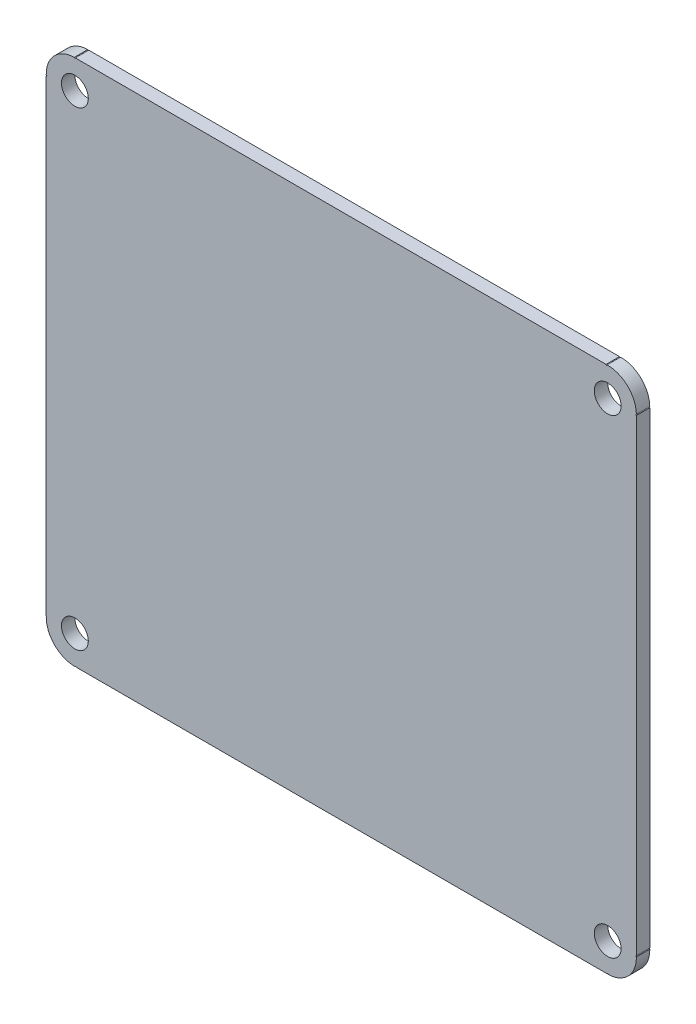
ISO-10303-21;
HEADER;
FILE_DESCRIPTION(('STEP AP214'),'2;1');
FILE_NAME('part.step','',(''),(''),'','','');
FILE_SCHEMA(('AUTOMOTIVE_DESIGN { 1 0 10303 214 1 1 1 1 }'));
ENDSEC;
DATA;
#1=APPLICATION_CONTEXT('core data for automotive mechanical design processes');
#2=APPLICATION_PROTOCOL_DEFINITION('international standard','automotive_design',2000,#1);
#3=PRODUCT_CONTEXT('',#1,'mechanical');
#4=PRODUCT('Part','Part','',(#3));
#5=PRODUCT_RELATED_PRODUCT_CATEGORY('part','',(#4));
#6=PRODUCT_DEFINITION_FORMATION('','',#4);
#7=PRODUCT_DEFINITION_CONTEXT('part definition',#1,'design');
#8=PRODUCT_DEFINITION('design','',#6,#7);
#9=PRODUCT_DEFINITION_SHAPE('','',#8);
#10=(LENGTH_UNIT() NAMED_UNIT(*) SI_UNIT(.MILLI.,.METRE.));
#11=(NAMED_UNIT(*) PLANE_ANGLE_UNIT() SI_UNIT($,.RADIAN.));
#12=(NAMED_UNIT(*) SI_UNIT($,.STERADIAN.) SOLID_ANGLE_UNIT());
#13=UNCERTAINTY_MEASURE_WITH_UNIT(LENGTH_MEASURE(1.E-05),#10,'distance_accuracy_value','');
#14=(GEOMETRIC_REPRESENTATION_CONTEXT(3) GLOBAL_UNCERTAINTY_ASSIGNED_CONTEXT((#13)) GLOBAL_UNIT_ASSIGNED_CONTEXT((#10,
#11,#12)) REPRESENTATION_CONTEXT('',''));
#15=CARTESIAN_POINT('',(0.,0.,0.));
#16=DIRECTION('',(0.,0.,1.));
#17=DIRECTION('',(1.,0.,0.));
#18=AXIS2_PLACEMENT_3D('',#15,#16,#17);
#19=CARTESIAN_POINT('',(28.2057813962286,41.7829996474484,1.6));
#20=DIRECTION('',(0.,0.,-1.));
#21=DIRECTION('',(-1.,0.,0.));
#22=AXIS2_PLACEMENT_3D('',#19,#20,#21);
#23=CYLINDRICAL_SURFACE('',#22,0.0634999999999999);
#24=CARTESIAN_POINT('',(28.2057813962286,41.7829996474484,0.));
#25=DIRECTION('',(0.,0.,1.));
#26=DIRECTION('',(1.,0.,0.));
#27=AXIS2_PLACEMENT_3D('',#24,#25,#26);
#28=CIRCLE('',#27,0.0634999999999999);
#29=CARTESIAN_POINT('',(28.206371386286,41.7195023883601,0.));
#30=VERTEX_POINT('',#29);
#31=CARTESIAN_POINT('',(28.2057813962286,41.8464996474484,0.));
#32=VERTEX_POINT('',#31);
#33=EDGE_CURVE('E262',#30,#32,#28,.T.);
#34=ORIENTED_EDGE('',*,*,#33,.F.);
#35=DIRECTION('',(0.,0.,-1.));
#36=VECTOR('',#35,1.);
#37=CARTESIAN_POINT('',(28.206371386286,41.7195023883601,1.6));
#38=LINE('',#37,#36);
#39=CARTESIAN_POINT('',(28.206371386286,41.7195023883601,1.6));
#40=VERTEX_POINT('',#39);
#41=EDGE_CURVE('E11',#40,#30,#38,.T.);
#42=ORIENTED_EDGE('',*,*,#41,.F.);
#43=CARTESIAN_POINT('',(28.2057813962286,41.7829996474484,1.6));
#44=DIRECTION('',(0.,0.,1.));
#45=DIRECTION('',(1.,0.,0.));
#46=AXIS2_PLACEMENT_3D('',#43,#44,#45);
#47=CIRCLE('',#46,0.0634999999999999);
#48=CARTESIAN_POINT('',(28.2057813962286,41.8464996474484,1.6));
#49=VERTEX_POINT('',#48);
#50=EDGE_CURVE('E252',#40,#49,#47,.T.);
#51=ORIENTED_EDGE('',*,*,#50,.T.);
#52=DIRECTION('',(0.,0.,-1.));
#53=VECTOR('',#52,1.);
#54=CARTESIAN_POINT('',(28.2057813962286,41.8464996474484,1.6));
#55=LINE('',#54,#53);
#56=EDGE_CURVE('E52',#49,#32,#55,.T.);
#57=ORIENTED_EDGE('',*,*,#56,.T.);
#58=EDGE_LOOP('',(#34,#42,#51,#57));
#59=FACE_BOUND('',#58,.T.);
#60=ADVANCED_FACE('F36',(#59),#23,.F.);
#61=CARTESIAN_POINT('',(31.623,41.7829996474484,1.6));
#62=DIRECTION('',(0.,0.,-1.));
#63=DIRECTION('',(-1.,0.,0.));
#64=AXIS2_PLACEMENT_3D('',#61,#62,#63);
#65=CYLINDRICAL_SURFACE('',#64,3.41721860377137);
#66=CARTESIAN_POINT('',(31.623,41.7829996474484,0.));
#67=DIRECTION('',(0.,0.,1.));
#68=DIRECTION('',(1.,0.,0.));
#69=AXIS2_PLACEMENT_3D('',#66,#67,#68);
#70=CIRCLE('',#69,3.41721860377137);
#71=CARTESIAN_POINT('',(31.6860011704876,38.3663618500695,0.));
#72=VERTEX_POINT('',#71);
#73=EDGE_CURVE('E306',#30,#72,#70,.T.);
#74=ORIENTED_EDGE('',*,*,#73,.T.);
#75=DIRECTION('',(0.,0.,-1.));
#76=VECTOR('',#75,1.);
#77=CARTESIAN_POINT('',(31.6860011704876,38.3663618500695,1.6));
#78=LINE('',#77,#76);
#79=CARTESIAN_POINT('',(31.6860011704876,38.3663618500695,1.6));
#80=VERTEX_POINT('',#79);
#81=EDGE_CURVE('E44',#80,#72,#78,.T.);
#82=ORIENTED_EDGE('',*,*,#81,.F.);
#83=CARTESIAN_POINT('',(31.623,41.7829996474484,1.6));
#84=DIRECTION('',(0.,0.,1.));
#85=DIRECTION('',(1.,0.,0.));
#86=AXIS2_PLACEMENT_3D('',#83,#84,#85);
#87=CIRCLE('',#86,3.41721860377137);
#88=EDGE_CURVE('E250',#40,#80,#87,.T.);
#89=ORIENTED_EDGE('',*,*,#88,.F.);
#90=ORIENTED_EDGE('',*,*,#41,.T.);
#91=EDGE_LOOP('',(#74,#82,#89,#90));
#92=FACE_BOUND('',#91,.T.);
#93=ADVANCED_FACE('F353',(#92),#65,.T.);
#94=CARTESIAN_POINT('',(31.74947676,38.3681224,1.6));
#95=DIRECTION('',(0.,0.,-1.));
#96=DIRECTION('',(-1.,0.,0.));
#97=AXIS2_PLACEMENT_3D('',#94,#95,#96);
#98=CYLINDRICAL_SURFACE('',#97,0.0634999999999941);
#99=CARTESIAN_POINT('',(31.74947676,38.3681224,0.));
#100=DIRECTION('',(0.,0.,1.));
#101=DIRECTION('',(1.,0.,0.));
#102=AXIS2_PLACEMENT_3D('',#99,#100,#101);
#103=CIRCLE('',#102,0.0634999999999941);
#104=CARTESIAN_POINT('',(31.81297676,38.3681224,0.));
#105=VERTEX_POINT('',#104);
#106=EDGE_CURVE('E350',#105,#72,#103,.T.);
#107=ORIENTED_EDGE('',*,*,#106,.F.);
#108=DIRECTION('',(0.,0.,-1.));
#109=VECTOR('',#108,1.);
#110=CARTESIAN_POINT('',(31.81297676,38.3681224,1.6));
#111=LINE('',#110,#109);
#112=CARTESIAN_POINT('',(31.81297676,38.3681224,1.6));
#113=VERTEX_POINT('',#112);
#114=EDGE_CURVE('E345',#113,#105,#111,.T.);
#115=ORIENTED_EDGE('',*,*,#114,.F.);
#116=CARTESIAN_POINT('',(31.74947676,38.3681224,1.6));
#117=DIRECTION('',(0.,0.,1.));
#118=DIRECTION('',(1.,0.,0.));
#119=AXIS2_PLACEMENT_3D('',#116,#117,#118);
#120=CIRCLE('',#119,0.0634999999999941);
#121=EDGE_CURVE('E247',#113,#80,#120,.T.);
#122=ORIENTED_EDGE('',*,*,#121,.T.);
#123=ORIENTED_EDGE('',*,*,#81,.T.);
#124=EDGE_LOOP('',(#107,#115,#122,#123));
#125=FACE_BOUND('',#124,.T.);
#126=ADVANCED_FACE('F349',(#125),#98,.F.);
#127=CARTESIAN_POINT('',(0.,38.3681224,1.6));
#128=DIRECTION('',(0.,1.,0.));
#129=DIRECTION('',(0.,0.,1.));
#130=AXIS2_PLACEMENT_3D('',#127,#128,#129);
#131=PLANE('',#130);
#132=DIRECTION('',(1.,0.,0.));
#133=VECTOR('',#132,1.);
#134=CARTESIAN_POINT('',(0.,38.3681224,0.));
#135=LINE('',#134,#133);
#136=CARTESIAN_POINT('',(95.0595,38.3681224,0.));
#137=VERTEX_POINT('',#136);
#138=EDGE_CURVE('E358',#105,#137,#135,.T.);
#139=ORIENTED_EDGE('',*,*,#138,.T.);
#140=DIRECTION('',(0.,0.,-1.));
#141=VECTOR('',#140,1.);
#142=CARTESIAN_POINT('',(95.0595,38.3681224,1.6));
#143=LINE('',#142,#141);
#144=CARTESIAN_POINT('',(95.0595,38.3681224,1.6));
#145=VERTEX_POINT('',#144);
#146=EDGE_CURVE('E343',#145,#137,#143,.T.);
#147=ORIENTED_EDGE('',*,*,#146,.F.);
#148=DIRECTION('',(1.,0.,0.));
#149=VECTOR('',#148,1.);
#150=CARTESIAN_POINT('',(0.,38.3681224,1.6));
#151=LINE('',#150,#149);
#152=EDGE_CURVE('E245',#113,#145,#151,.T.);
#153=ORIENTED_EDGE('',*,*,#152,.F.);
#154=ORIENTED_EDGE('',*,*,#114,.T.);
#155=EDGE_LOOP('',(#139,#147,#153,#154));
#156=FACE_BOUND('',#155,.T.);
#157=ADVANCED_FACE('F456',(#156),#131,.F.);
#158=CARTESIAN_POINT('',(95.123,38.3681224,1.6));
#159=DIRECTION('',(0.,0.,-1.));
#160=DIRECTION('',(-1.,0.,0.));
#161=AXIS2_PLACEMENT_3D('',#158,#159,#160);
#162=CYLINDRICAL_SURFACE('',#161,0.0635000000000085);
#163=CARTESIAN_POINT('',(95.123,38.3681224,0.));
#164=DIRECTION('',(0.,0.,1.));
#165=DIRECTION('',(1.,0.,0.));
#166=AXIS2_PLACEMENT_3D('',#163,#164,#165);
#167=CIRCLE('',#166,0.0635000000000085);
#168=CARTESIAN_POINT('',(95.1864892078439,38.3669517218385,0.));
#169=VERTEX_POINT('',#168);
#170=EDGE_CURVE('E360',#169,#137,#167,.T.);
#171=ORIENTED_EDGE('',*,*,#170,.F.);
#172=DIRECTION('',(0.,0.,-1.));
#173=VECTOR('',#172,1.);
#174=CARTESIAN_POINT('',(95.1864892078439,38.3669517218385,1.6));
#175=LINE('',#174,#173);
#176=CARTESIAN_POINT('',(95.1864892078439,38.3669517218385,1.6));
#177=VERTEX_POINT('',#176);
#178=EDGE_CURVE('E341',#177,#169,#175,.T.);
#179=ORIENTED_EDGE('',*,*,#178,.F.);
#180=CARTESIAN_POINT('',(95.123,38.3681224,1.6));
#181=DIRECTION('',(0.,0.,1.));
#182=DIRECTION('',(1.,0.,0.));
#183=AXIS2_PLACEMENT_3D('',#180,#181,#182);
#184=CIRCLE('',#183,0.0635000000000085);
#185=EDGE_CURVE('E242',#177,#145,#184,.T.);
#186=ORIENTED_EDGE('',*,*,#185,.T.);
#187=ORIENTED_EDGE('',*,*,#146,.T.);
#188=EDGE_LOOP('',(#171,#179,#186,#187));
#189=FACE_BOUND('',#188,.T.);
#190=ADVANCED_FACE('F452',(#189),#162,.F.);
#191=CARTESIAN_POINT('',(95.123,38.3657810436771,1.6));
#192=DIRECTION('',(0.,0.,-1.));
#193=DIRECTION('',(-1.,0.,0.));
#194=AXIS2_PLACEMENT_3D('',#191,#192,#193);
#195=CYLINDRICAL_SURFACE('',#194,0.0634999999999933);
#196=CARTESIAN_POINT('',(95.123,38.3657810436771,0.));
#197=DIRECTION('',(0.,0.,1.));
#198=DIRECTION('',(1.,0.,0.));
#199=AXIS2_PLACEMENT_3D('',#196,#197,#198);
#200=CIRCLE('',#199,0.0634999999999933);
#201=CARTESIAN_POINT('',(95.1864972590884,38.3663710337344,0.));
#202=VERTEX_POINT('',#201);
#203=EDGE_CURVE('E364',#202,#169,#200,.T.);
#204=ORIENTED_EDGE('',*,*,#203,.F.);
#205=DIRECTION('',(0.,0.,-1.));
#206=VECTOR('',#205,1.);
#207=CARTESIAN_POINT('',(95.1864972590884,38.3663710337344,1.6));
#208=LINE('',#207,#206);
#209=CARTESIAN_POINT('',(95.1864972590884,38.3663710337344,1.6));
#210=VERTEX_POINT('',#209);
#211=EDGE_CURVE('E339',#210,#202,#208,.T.);
#212=ORIENTED_EDGE('',*,*,#211,.F.);
#213=CARTESIAN_POINT('',(95.123,38.3657810436771,1.6));
#214=DIRECTION('',(0.,0.,1.));
#215=DIRECTION('',(1.,0.,0.));
#216=AXIS2_PLACEMENT_3D('',#213,#214,#215);
#217=CIRCLE('',#216,0.0634999999999933);
#218=EDGE_CURVE('E239',#210,#177,#217,.T.);
#219=ORIENTED_EDGE('',*,*,#218,.T.);
#220=ORIENTED_EDGE('',*,*,#178,.T.);
#221=EDGE_LOOP('',(#204,#212,#219,#220));
#222=FACE_BOUND('',#221,.T.);
#223=ADVANCED_FACE('F447',(#222),#195,.F.);
#224=CARTESIAN_POINT('',(95.123,41.7829996474484,1.6));
#225=DIRECTION('',(0.,0.,-1.));
#226=DIRECTION('',(-1.,0.,0.));
#227=AXIS2_PLACEMENT_3D('',#224,#225,#226);
#228=CYLINDRICAL_SURFACE('',#227,3.41721860377137);
#229=CARTESIAN_POINT('',(95.123,41.7829996474484,0.));
#230=DIRECTION('',(0.,0.,1.));
#231=DIRECTION('',(1.,0.,0.));
#232=AXIS2_PLACEMENT_3D('',#229,#230,#231);
#233=CIRCLE('',#232,3.41721860377137);
#234=CARTESIAN_POINT('',(98.5396377912323,41.8460011512772,0.));
#235=VERTEX_POINT('',#234);
#236=EDGE_CURVE('E367',#202,#235,#233,.T.);
#237=ORIENTED_EDGE('',*,*,#236,.T.);
#238=DIRECTION('',(0.,0.,-1.));
#239=VECTOR('',#238,1.);
#240=CARTESIAN_POINT('',(98.5396377912323,41.8460011512772,1.6));
#241=LINE('',#240,#239);
#242=CARTESIAN_POINT('',(98.5396377912323,41.8460011512772,1.6));
#243=VERTEX_POINT('',#242);
#244=EDGE_CURVE('E337',#243,#235,#241,.T.);
#245=ORIENTED_EDGE('',*,*,#244,.F.);
#246=CARTESIAN_POINT('',(95.123,41.7829996474484,1.6));
#247=DIRECTION('',(0.,0.,1.));
#248=DIRECTION('',(1.,0.,0.));
#249=AXIS2_PLACEMENT_3D('',#246,#247,#248);
#250=CIRCLE('',#249,3.41721860377137);
#251=EDGE_CURVE('E237',#210,#243,#250,.T.);
#252=ORIENTED_EDGE('',*,*,#251,.F.);
#253=ORIENTED_EDGE('',*,*,#211,.T.);
#254=EDGE_LOOP('',(#237,#245,#252,#253));
#255=FACE_BOUND('',#254,.T.);
#256=ADVANCED_FACE('F444',(#255),#228,.T.);
#257=CARTESIAN_POINT('',(98.5378772351088,41.9094767406178,1.6));
#258=DIRECTION('',(0.,0.,-1.));
#259=DIRECTION('',(-1.,0.,0.));
#260=AXIS2_PLACEMENT_3D('',#257,#258,#259);
#261=CYLINDRICAL_SURFACE('',#260,0.0635000000000085);
#262=CARTESIAN_POINT('',(98.5378772351088,41.9094767406178,0.));
#263=DIRECTION('',(0.,0.,1.));
#264=DIRECTION('',(1.,0.,0.));
#265=AXIS2_PLACEMENT_3D('',#262,#263,#264);
#266=CIRCLE('',#265,0.0635000000000085);
#267=CARTESIAN_POINT('',(98.5378772351088,41.9729767406178,0.));
#268=VERTEX_POINT('',#267);
#269=EDGE_CURVE('E370',#268,#235,#266,.T.);
#270=ORIENTED_EDGE('',*,*,#269,.F.);
#271=DIRECTION('',(0.,0.,-1.));
#272=VECTOR('',#271,1.);
#273=CARTESIAN_POINT('',(98.5378772351088,41.9729767406178,1.6));
#274=LINE('',#273,#272);
#275=CARTESIAN_POINT('',(98.5378772351088,41.9729767406178,1.6));
#276=VERTEX_POINT('',#275);
#277=EDGE_CURVE('E335',#276,#268,#274,.T.);
#278=ORIENTED_EDGE('',*,*,#277,.F.);
#279=CARTESIAN_POINT('',(98.5378772351088,41.9094767406178,1.6));
#280=DIRECTION('',(0.,0.,1.));
#281=DIRECTION('',(1.,0.,0.));
#282=AXIS2_PLACEMENT_3D('',#279,#280,#281);
#283=CIRCLE('',#282,0.0635000000000085);
#284=EDGE_CURVE('E234',#276,#243,#283,.T.);
#285=ORIENTED_EDGE('',*,*,#284,.T.);
#286=ORIENTED_EDGE('',*,*,#244,.T.);
#287=EDGE_LOOP('',(#270,#278,#285,#286));
#288=FACE_BOUND('',#287,.T.);
#289=ADVANCED_FACE('F438',(#288),#261,.F.);
#290=CARTESIAN_POINT('',(98.5378772351088,0.,1.6));
#291=DIRECTION('',(-1.,0.,0.));
#292=DIRECTION('',(0.,0.,1.));
#293=AXIS2_PLACEMENT_3D('',#290,#291,#292);
#294=PLANE('',#293);
#295=DIRECTION('',(0.,1.,0.));
#296=VECTOR('',#295,1.);
#297=CARTESIAN_POINT('',(98.5378772351088,0.,0.));
#298=LINE('',#297,#296);
#299=CARTESIAN_POINT('',(98.5378772351088,97.7265003525515,0.));
#300=VERTEX_POINT('',#299);
#301=EDGE_CURVE('E373',#268,#300,#298,.T.);
#302=ORIENTED_EDGE('',*,*,#301,.T.);
#303=DIRECTION('',(0.,0.,-1.));
#304=VECTOR('',#303,1.);
#305=CARTESIAN_POINT('',(98.5378772351088,97.7265003525515,1.6));
#306=LINE('',#305,#304);
#307=CARTESIAN_POINT('',(98.5378772351088,97.7265003525515,1.6));
#308=VERTEX_POINT('',#307);
#309=EDGE_CURVE('E333',#308,#300,#306,.T.);
#310=ORIENTED_EDGE('',*,*,#309,.F.);
#311=DIRECTION('',(0.,1.,0.));
#312=VECTOR('',#311,1.);
#313=CARTESIAN_POINT('',(98.5378772351088,0.,1.6));
#314=LINE('',#313,#312);
#315=EDGE_CURVE('E232',#276,#308,#314,.T.);
#316=ORIENTED_EDGE('',*,*,#315,.F.);
#317=ORIENTED_EDGE('',*,*,#277,.T.);
#318=EDGE_LOOP('',(#302,#310,#316,#317));
#319=FACE_BOUND('',#318,.T.);
#320=ADVANCED_FACE('F476',(#319),#294,.F.);
#321=CARTESIAN_POINT('',(98.5378772351088,97.7900003525515,1.6));
#322=DIRECTION('',(0.,0.,-1.));
#323=DIRECTION('',(-1.,0.,0.));
#324=AXIS2_PLACEMENT_3D('',#321,#322,#323);
#325=CYLINDRICAL_SURFACE('',#324,0.0635000000000065);
#326=CARTESIAN_POINT('',(98.5378772351088,97.7900003525515,0.));
#327=DIRECTION('',(0.,0.,1.));
#328=DIRECTION('',(1.,0.,0.));
#329=AXIS2_PLACEMENT_3D('',#326,#327,#328);
#330=CIRCLE('',#329,0.0635000000000065);
#331=CARTESIAN_POINT('',(98.5390479194405,97.8534895602817,0.));
#332=VERTEX_POINT('',#331);
#333=EDGE_CURVE('E376',#332,#300,#330,.T.);
#334=ORIENTED_EDGE('',*,*,#333,.F.);
#335=DIRECTION('',(0.,0.,-1.));
#336=VECTOR('',#335,1.);
#337=CARTESIAN_POINT('',(98.5390479194405,97.8534895602817,1.6));
#338=LINE('',#337,#336);
#339=CARTESIAN_POINT('',(98.5390479194405,97.8534895602817,1.6));
#340=VERTEX_POINT('',#339);
#341=EDGE_CURVE('E331',#340,#332,#338,.T.);
#342=ORIENTED_EDGE('',*,*,#341,.F.);
#343=CARTESIAN_POINT('',(98.5378772351088,97.7900003525515,1.6));
#344=DIRECTION('',(0.,0.,1.));
#345=DIRECTION('',(1.,0.,0.));
#346=AXIS2_PLACEMENT_3D('',#343,#344,#345);
#347=CIRCLE('',#346,0.0635000000000065);
#348=EDGE_CURVE('E229',#340,#308,#347,.T.);
#349=ORIENTED_EDGE('',*,*,#348,.T.);
#350=ORIENTED_EDGE('',*,*,#309,.T.);
#351=EDGE_LOOP('',(#334,#342,#349,#350));
#352=FACE_BOUND('',#351,.T.);
#353=ADVANCED_FACE('F431',(#352),#325,.F.);
#354=CARTESIAN_POINT('',(98.5402186037714,97.7900003525515,1.6));
#355=DIRECTION('',(0.,0.,-1.));
#356=DIRECTION('',(-1.,0.,0.));
#357=AXIS2_PLACEMENT_3D('',#354,#355,#356);
#358=CYLINDRICAL_SURFACE('',#357,0.0634999999999933);
#359=CARTESIAN_POINT('',(98.5402186037714,97.7900003525515,0.));
#360=DIRECTION('',(0.,0.,1.));
#361=DIRECTION('',(1.,0.,0.));
#362=AXIS2_PLACEMENT_3D('',#359,#360,#361);
#363=CIRCLE('',#362,0.0634999999999933);
#364=CARTESIAN_POINT('',(98.539628613714,97.8534976116399,0.));
#365=VERTEX_POINT('',#364);
#366=EDGE_CURVE('E379',#365,#332,#363,.T.);
#367=ORIENTED_EDGE('',*,*,#366,.F.);
#368=DIRECTION('',(0.,0.,-1.));
#369=VECTOR('',#368,1.);
#370=CARTESIAN_POINT('',(98.539628613714,97.8534976116399,1.6));
#371=LINE('',#370,#369);
#372=CARTESIAN_POINT('',(98.539628613714,97.8534976116399,1.6));
#373=VERTEX_POINT('',#372);
#374=EDGE_CURVE('E329',#373,#365,#371,.T.);
#375=ORIENTED_EDGE('',*,*,#374,.F.);
#376=CARTESIAN_POINT('',(98.5402186037714,97.7900003525515,1.6));
#377=DIRECTION('',(0.,0.,1.));
#378=DIRECTION('',(1.,0.,0.));
#379=AXIS2_PLACEMENT_3D('',#376,#377,#378);
#380=CIRCLE('',#379,0.0634999999999933);
#381=EDGE_CURVE('E226',#373,#340,#380,.T.);
#382=ORIENTED_EDGE('',*,*,#381,.T.);
#383=ORIENTED_EDGE('',*,*,#341,.T.);
#384=EDGE_LOOP('',(#367,#375,#382,#383));
#385=FACE_BOUND('',#384,.T.);
#386=ADVANCED_FACE('F425',(#385),#358,.F.);
#387=CARTESIAN_POINT('',(95.123,97.7900003525515,1.6));
#388=DIRECTION('',(0.,0.,-1.));
#389=DIRECTION('',(-1.,0.,0.));
#390=AXIS2_PLACEMENT_3D('',#387,#388,#389);
#391=CYLINDRICAL_SURFACE('',#390,3.41721860377138);
#392=CARTESIAN_POINT('',(95.123,97.7900003525515,0.));
#393=DIRECTION('',(0.,0.,1.));
#394=DIRECTION('',(1.,0.,0.));
#395=AXIS2_PLACEMENT_3D('',#392,#393,#394);
#396=CIRCLE('',#395,3.41721860377138);
#397=CARTESIAN_POINT('',(95.0599988295124,101.20663814993,0.));
#398=VERTEX_POINT('',#397);
#399=EDGE_CURVE('E382',#365,#398,#396,.T.);
#400=ORIENTED_EDGE('',*,*,#399,.T.);
#401=DIRECTION('',(0.,0.,-1.));
#402=VECTOR('',#401,1.);
#403=CARTESIAN_POINT('',(95.0599988295124,101.20663814993,1.6));
#404=LINE('',#403,#402);
#405=CARTESIAN_POINT('',(95.0599988295124,101.20663814993,1.6));
#406=VERTEX_POINT('',#405);
#407=EDGE_CURVE('E327',#406,#398,#404,.T.);
#408=ORIENTED_EDGE('',*,*,#407,.F.);
#409=CARTESIAN_POINT('',(95.123,97.7900003525515,1.6));
#410=DIRECTION('',(0.,0.,1.));
#411=DIRECTION('',(1.,0.,0.));
#412=AXIS2_PLACEMENT_3D('',#409,#410,#411);
#413=CIRCLE('',#412,3.41721860377138);
#414=EDGE_CURVE('E224',#373,#406,#413,.T.);
#415=ORIENTED_EDGE('',*,*,#414,.F.);
#416=ORIENTED_EDGE('',*,*,#374,.T.);
#417=EDGE_LOOP('',(#400,#408,#415,#416));
#418=FACE_BOUND('',#417,.T.);
#419=ADVANCED_FACE('F483',(#418),#391,.T.);
#420=CARTESIAN_POINT('',(94.99652324,101.2048776,1.6));
#421=DIRECTION('',(0.,0.,-1.));
#422=DIRECTION('',(-1.,0.,0.));
#423=AXIS2_PLACEMENT_3D('',#420,#421,#422);
#424=CYLINDRICAL_SURFACE('',#423,0.063500000000008);
#425=CARTESIAN_POINT('',(94.99652324,101.2048776,0.));
#426=DIRECTION('',(0.,0.,1.));
#427=DIRECTION('',(1.,0.,0.));
#428=AXIS2_PLACEMENT_3D('',#425,#426,#427);
#429=CIRCLE('',#428,0.063500000000008);
#430=CARTESIAN_POINT('',(94.93302324,101.2048776,0.));
#431=VERTEX_POINT('',#430);
#432=EDGE_CURVE('E385',#431,#398,#429,.T.);
#433=ORIENTED_EDGE('',*,*,#432,.F.);
#434=DIRECTION('',(0.,0.,-1.));
#435=VECTOR('',#434,1.);
#436=CARTESIAN_POINT('',(94.93302324,101.2048776,1.6));
#437=LINE('',#436,#435);
#438=CARTESIAN_POINT('',(94.93302324,101.2048776,1.6));
#439=VERTEX_POINT('',#438);
#440=EDGE_CURVE('E325',#439,#431,#437,.T.);
#441=ORIENTED_EDGE('',*,*,#440,.F.);
#442=CARTESIAN_POINT('',(94.99652324,101.2048776,1.6));
#443=DIRECTION('',(0.,0.,1.));
#444=DIRECTION('',(1.,0.,0.));
#445=AXIS2_PLACEMENT_3D('',#442,#443,#444);
#446=CIRCLE('',#445,0.063500000000008);
#447=EDGE_CURVE('E221',#439,#406,#446,.T.);
#448=ORIENTED_EDGE('',*,*,#447,.T.);
#449=ORIENTED_EDGE('',*,*,#407,.T.);
#450=EDGE_LOOP('',(#433,#441,#448,#449));
#451=FACE_BOUND('',#450,.T.);
#452=ADVANCED_FACE('F419',(#451),#424,.F.);
#453=CARTESIAN_POINT('',(0.,101.2048776,1.6));
#454=DIRECTION('',(0.,1.,0.));
#455=DIRECTION('',(0.,0.,1.));
#456=AXIS2_PLACEMENT_3D('',#453,#454,#455);
#457=PLANE('',#456);
#458=DIRECTION('',(1.,0.,0.));
#459=VECTOR('',#458,1.);
#460=CARTESIAN_POINT('',(0.,101.2048776,0.));
#461=LINE('',#460,#459);
#462=CARTESIAN_POINT('',(31.6865,101.2048776,0.));
#463=VERTEX_POINT('',#462);
#464=EDGE_CURVE('E388',#463,#431,#461,.T.);
#465=ORIENTED_EDGE('',*,*,#464,.F.);
#466=DIRECTION('',(0.,0.,-1.));
#467=VECTOR('',#466,1.);
#468=CARTESIAN_POINT('',(31.6865,101.2048776,1.6));
#469=LINE('',#468,#467);
#470=CARTESIAN_POINT('',(31.6865,101.2048776,1.6));
#471=VERTEX_POINT('',#470);
#472=EDGE_CURVE('E323',#471,#463,#469,.T.);
#473=ORIENTED_EDGE('',*,*,#472,.F.);
#474=DIRECTION('',(1.,0.,0.));
#475=VECTOR('',#474,1.);
#476=CARTESIAN_POINT('',(0.,101.2048776,1.6));
#477=LINE('',#476,#475);
#478=EDGE_CURVE('E218',#471,#439,#477,.T.);
#479=ORIENTED_EDGE('',*,*,#478,.T.);
#480=ORIENTED_EDGE('',*,*,#440,.T.);
#481=EDGE_LOOP('',(#465,#473,#479,#480));
#482=FACE_BOUND('',#481,.T.);
#483=ADVANCED_FACE('F415',(#482),#457,.T.);
#484=CARTESIAN_POINT('',(31.623,101.2048776,1.6));
#485=DIRECTION('',(0.,0.,-1.));
#486=DIRECTION('',(-1.,0.,0.));
#487=AXIS2_PLACEMENT_3D('',#484,#485,#486);
#488=CYLINDRICAL_SURFACE('',#487,0.0635000000000011);
#489=CARTESIAN_POINT('',(31.623,101.2048776,0.));
#490=DIRECTION('',(0.,0.,1.));
#491=DIRECTION('',(1.,0.,0.));
#492=AXIS2_PLACEMENT_3D('',#489,#490,#491);
#493=CIRCLE('',#492,0.0635000000000011);
#494=CARTESIAN_POINT('',(31.5595107921561,101.206048278162,0.));
#495=VERTEX_POINT('',#494);
#496=EDGE_CURVE('E391',#495,#463,#493,.T.);
#497=ORIENTED_EDGE('',*,*,#496,.F.);
#498=DIRECTION('',(0.,0.,-1.));
#499=VECTOR('',#498,1.);
#500=CARTESIAN_POINT('',(31.5595107921561,101.206048278162,1.6));
#501=LINE('',#500,#499);
#502=CARTESIAN_POINT('',(31.5595107921561,101.206048278162,1.6));
#503=VERTEX_POINT('',#502);
#504=EDGE_CURVE('E321',#503,#495,#501,.T.);
#505=ORIENTED_EDGE('',*,*,#504,.F.);
#506=CARTESIAN_POINT('',(31.623,101.2048776,1.6));
#507=DIRECTION('',(0.,0.,1.));
#508=DIRECTION('',(1.,0.,0.));
#509=AXIS2_PLACEMENT_3D('',#506,#507,#508);
#510=CIRCLE('',#509,0.0635000000000011);
#511=EDGE_CURVE('E213',#503,#471,#510,.T.);
#512=ORIENTED_EDGE('',*,*,#511,.T.);
#513=ORIENTED_EDGE('',*,*,#472,.T.);
#514=EDGE_LOOP('',(#497,#505,#512,#513));
#515=FACE_BOUND('',#514,.T.);
#516=ADVANCED_FACE('F411',(#515),#488,.F.);
#517=CARTESIAN_POINT('',(31.623,101.207218956323,1.6));
#518=DIRECTION('',(0.,0.,-1.));
#519=DIRECTION('',(-1.,0.,0.));
#520=AXIS2_PLACEMENT_3D('',#517,#518,#519);
#521=CYLINDRICAL_SURFACE('',#520,0.0634999999999999);
#522=CARTESIAN_POINT('',(31.623,101.207218956323,0.));
#523=DIRECTION('',(0.,0.,1.));
#524=DIRECTION('',(1.,0.,0.));
#525=AXIS2_PLACEMENT_3D('',#522,#523,#524);
#526=CIRCLE('',#525,0.0634999999999999);
#527=CARTESIAN_POINT('',(31.5595027409117,101.206628966266,0.));
#528=VERTEX_POINT('',#527);
#529=EDGE_CURVE('E394',#528,#495,#526,.T.);
#530=ORIENTED_EDGE('',*,*,#529,.F.);
#531=DIRECTION('',(0.,0.,-1.));
#532=VECTOR('',#531,1.);
#533=CARTESIAN_POINT('',(31.5595027409117,101.206628966266,1.6));
#534=LINE('',#533,#532);
#535=CARTESIAN_POINT('',(31.5595027409117,101.206628966266,1.6));
#536=VERTEX_POINT('',#535);
#537=EDGE_CURVE('E319',#536,#528,#534,.T.);
#538=ORIENTED_EDGE('',*,*,#537,.F.);
#539=CARTESIAN_POINT('',(31.623,101.207218956323,1.6));
#540=DIRECTION('',(0.,0.,1.));
#541=DIRECTION('',(1.,0.,0.));
#542=AXIS2_PLACEMENT_3D('',#539,#540,#541);
#543=CIRCLE('',#542,0.0634999999999999);
#544=EDGE_CURVE('E208',#536,#503,#543,.T.);
#545=ORIENTED_EDGE('',*,*,#544,.T.);
#546=ORIENTED_EDGE('',*,*,#504,.T.);
#547=EDGE_LOOP('',(#530,#538,#545,#546));
#548=FACE_BOUND('',#547,.T.);
#549=ADVANCED_FACE('F407',(#548),#521,.F.);
#550=CARTESIAN_POINT('',(31.623,97.7900003525515,1.6));
#551=DIRECTION('',(0.,0.,-1.));
#552=DIRECTION('',(-1.,0.,0.));
#553=AXIS2_PLACEMENT_3D('',#550,#551,#552);
#554=CYLINDRICAL_SURFACE('',#553,3.41721860377138);
#555=CARTESIAN_POINT('',(31.623,97.7900003525515,0.));
#556=DIRECTION('',(0.,0.,1.));
#557=DIRECTION('',(1.,0.,0.));
#558=AXIS2_PLACEMENT_3D('',#555,#556,#557);
#559=CIRCLE('',#558,3.41721860377138);
#560=CARTESIAN_POINT('',(28.2063618076273,97.7270206067489,0.));
#561=VERTEX_POINT('',#560);
#562=EDGE_CURVE('E397',#528,#561,#559,.T.);
#563=ORIENTED_EDGE('',*,*,#562,.T.);
#564=DIRECTION('',(0.,0.,-1.));
#565=VECTOR('',#564,1.);
#566=CARTESIAN_POINT('',(28.2063618076273,97.7270206067489,1.6));
#567=LINE('',#566,#565);
#568=CARTESIAN_POINT('',(28.2063618076273,97.7270206067489,1.6));
#569=VERTEX_POINT('',#568);
#570=EDGE_CURVE('E317',#569,#561,#567,.T.);
#571=ORIENTED_EDGE('',*,*,#570,.F.);
#572=CARTESIAN_POINT('',(31.623,97.7900003525515,1.6));
#573=DIRECTION('',(0.,0.,1.));
#574=DIRECTION('',(1.,0.,0.));
#575=AXIS2_PLACEMENT_3D('',#572,#573,#574);
#576=CIRCLE('',#575,3.41721860377138);
#577=EDGE_CURVE('E206',#536,#569,#576,.T.);
#578=ORIENTED_EDGE('',*,*,#577,.F.);
#579=ORIENTED_EDGE('',*,*,#537,.T.);
#580=EDGE_LOOP('',(#563,#571,#578,#579));
#581=FACE_BOUND('',#580,.T.);
#582=ADVANCED_FACE('F405',(#581),#554,.T.);
#583=CARTESIAN_POINT('',(28.2057813962286,97.6635232593822,1.6));
#584=DIRECTION('',(0.,0.,-1.));
#585=DIRECTION('',(-1.,0.,0.));
#586=AXIS2_PLACEMENT_3D('',#583,#584,#585);
#587=CYLINDRICAL_SURFACE('',#586,0.0634999999999999);
#588=CARTESIAN_POINT('',(28.2057813962286,97.6635232593822,0.));
#589=DIRECTION('',(0.,0.,1.));
#590=DIRECTION('',(1.,0.,0.));
#591=AXIS2_PLACEMENT_3D('',#588,#589,#590);
#592=CIRCLE('',#591,0.0634999999999999);
#593=CARTESIAN_POINT('',(28.2069520805595,97.7270124671123,0.));
#594=VERTEX_POINT('',#593);
#595=EDGE_CURVE('E311',#594,#561,#592,.T.);
#596=ORIENTED_EDGE('',*,*,#595,.F.);
#597=DIRECTION('',(0.,0.,-1.));
#598=VECTOR('',#597,1.);
#599=CARTESIAN_POINT('',(28.2069520805595,97.7270124671123,1.6));
#600=LINE('',#599,#598);
#601=CARTESIAN_POINT('',(28.2069520805595,97.7270124671123,1.6));
#602=VERTEX_POINT('',#601);
#603=EDGE_CURVE('E189',#602,#594,#600,.T.);
#604=ORIENTED_EDGE('',*,*,#603,.F.);
#605=CARTESIAN_POINT('',(28.2057813962286,97.6635232593822,1.6));
#606=DIRECTION('',(0.,0.,1.));
#607=DIRECTION('',(1.,0.,0.));
#608=AXIS2_PLACEMENT_3D('',#605,#606,#607);
#609=CIRCLE('',#608,0.0634999999999999);
#610=EDGE_CURVE('E199',#602,#569,#609,.T.);
#611=ORIENTED_EDGE('',*,*,#610,.T.);
#612=ORIENTED_EDGE('',*,*,#570,.T.);
#613=EDGE_LOOP('',(#596,#604,#611,#612));
#614=FACE_BOUND('',#613,.T.);
#615=ADVANCED_FACE('F403',(#614),#587,.F.);
#616=CARTESIAN_POINT('',(28.2081227648912,97.6635232593822,1.6));
#617=DIRECTION('',(0.,0.,-1.));
#618=DIRECTION('',(-1.,0.,0.));
#619=AXIS2_PLACEMENT_3D('',#616,#617,#618);
#620=CYLINDRICAL_SURFACE('',#619,0.0634999999999999);
#621=CARTESIAN_POINT('',(28.2081227648912,97.6635232593822,0.));
#622=DIRECTION('',(0.,0.,1.));
#623=DIRECTION('',(1.,0.,0.));
#624=AXIS2_PLACEMENT_3D('',#621,#622,#623);
#625=CIRCLE('',#624,0.0634999999999999);
#626=CARTESIAN_POINT('',(28.2069520805603,97.6000340516521,0.));
#627=VERTEX_POINT('',#626);
#628=EDGE_CURVE('E185',#627,#594,#625,.T.);
#629=ORIENTED_EDGE('',*,*,#628,.F.);
#630=DIRECTION('',(0.,0.,-1.));
#631=VECTOR('',#630,1.);
#632=CARTESIAN_POINT('',(28.2069520805603,97.6000340516521,1.6));
#633=LINE('',#632,#631);
#634=CARTESIAN_POINT('',(28.2069520805603,97.6000340516521,1.6));
#635=VERTEX_POINT('',#634);
#636=EDGE_CURVE('E180',#635,#627,#633,.T.);
#637=ORIENTED_EDGE('',*,*,#636,.F.);
#638=CARTESIAN_POINT('',(28.2081227648912,97.6635232593822,1.6));
#639=DIRECTION('',(0.,0.,1.));
#640=DIRECTION('',(1.,0.,0.));
#641=AXIS2_PLACEMENT_3D('',#638,#639,#640);
#642=CIRCLE('',#641,0.0634999999999999);
#643=EDGE_CURVE('E183',#635,#602,#642,.T.);
#644=ORIENTED_EDGE('',*,*,#643,.T.);
#645=ORIENTED_EDGE('',*,*,#603,.T.);
#646=EDGE_LOOP('',(#629,#637,#644,#645));
#647=FACE_BOUND('',#646,.T.);
#648=ADVANCED_FACE('F182',(#647),#620,.F.);
#649=CARTESIAN_POINT('',(28.2057813962286,97.6000232593822,0.));
#650=VERTEX_POINT('',#649);
#651=EDGE_CURVE('E308',#650,#627,#592,.T.);
#652=ORIENTED_EDGE('',*,*,#651,.F.);
#653=DIRECTION('',(0.,0.,-1.));
#654=VECTOR('',#653,1.);
#655=CARTESIAN_POINT('',(28.2057813962286,97.6000232593822,1.6));
#656=LINE('',#655,#654);
#657=CARTESIAN_POINT('',(28.2057813962286,97.6000232593822,1.6));
#658=VERTEX_POINT('',#657);
#659=EDGE_CURVE('E116',#658,#650,#656,.T.);
#660=ORIENTED_EDGE('',*,*,#659,.F.);
#661=EDGE_CURVE('E197',#658,#635,#609,.T.);
#662=ORIENTED_EDGE('',*,*,#661,.T.);
#663=ORIENTED_EDGE('',*,*,#636,.T.);
#664=EDGE_LOOP('',(#652,#660,#662,#663));
#665=FACE_BOUND('',#664,.T.);
#666=ADVANCED_FACE('F201',(#665),#587,.F.);
#667=CARTESIAN_POINT('',(28.2057813962286,0.,1.6));
#668=DIRECTION('',(-1.,0.,0.));
#669=DIRECTION('',(0.,0.,1.));
#670=AXIS2_PLACEMENT_3D('',#667,#668,#669);
#671=PLANE('',#670);
#672=DIRECTION('',(0.,1.,0.));
#673=VECTOR('',#672,1.);
#674=CARTESIAN_POINT('',(28.2057813962286,0.,0.));
#675=LINE('',#674,#673);
#676=EDGE_CURVE('E254',#32,#650,#675,.T.);
#677=ORIENTED_EDGE('',*,*,#676,.F.);
#678=ORIENTED_EDGE('',*,*,#56,.F.);
#679=DIRECTION('',(0.,1.,0.));
#680=VECTOR('',#679,1.);
#681=CARTESIAN_POINT('',(28.2057813962286,0.,1.6));
#682=LINE('',#681,#680);
#683=EDGE_CURVE('E202',#49,#658,#682,.T.);
#684=ORIENTED_EDGE('',*,*,#683,.T.);
#685=ORIENTED_EDGE('',*,*,#659,.T.);
#686=EDGE_LOOP('',(#677,#678,#684,#685));
#687=FACE_BOUND('',#686,.T.);
#688=ADVANCED_FACE('F287',(#687),#671,.T.);
#689=CARTESIAN_POINT('',(0.,0.,1.6));
#690=DIRECTION('',(0.,0.,1.));
#691=DIRECTION('',(1.,0.,0.));
#692=AXIS2_PLACEMENT_3D('',#689,#690,#691);
#693=PLANE('',#692);
#694=CARTESIAN_POINT('',(31.623,97.79,1.6));
#695=DIRECTION('',(0.,0.,1.));
#696=DIRECTION('',(1.,0.,0.));
#697=AXIS2_PLACEMENT_3D('',#694,#695,#696);
#698=CIRCLE('',#697,1.6);
#699=CARTESIAN_POINT('',(33.223,97.79,1.6));
#700=VERTEX_POINT('',#699);
#701=EDGE_CURVE('E266',#700,#700,#698,.T.);
#702=ORIENTED_EDGE('',*,*,#701,.F.);
#703=EDGE_LOOP('',(#702));
#704=FACE_BOUND('',#703,.T.);
#705=CARTESIAN_POINT('',(31.623,41.783,1.6));
#706=DIRECTION('',(0.,0.,1.));
#707=DIRECTION('',(1.,0.,0.));
#708=AXIS2_PLACEMENT_3D('',#705,#706,#707);
#709=CIRCLE('',#708,1.6);
#710=CARTESIAN_POINT('',(33.223,41.783,1.6));
#711=VERTEX_POINT('',#710);
#712=EDGE_CURVE('E272',#711,#711,#709,.T.);
#713=ORIENTED_EDGE('',*,*,#712,.F.);
#714=EDGE_LOOP('',(#713));
#715=FACE_BOUND('',#714,.T.);
#716=CARTESIAN_POINT('',(95.12300254,41.783,1.6));
#717=DIRECTION('',(0.,0.,1.));
#718=DIRECTION('',(1.,0.,0.));
#719=AXIS2_PLACEMENT_3D('',#716,#717,#718);
#720=CIRCLE('',#719,1.60000000000001);
#721=CARTESIAN_POINT('',(96.72300254,41.783,1.6));
#722=VERTEX_POINT('',#721);
#723=EDGE_CURVE('E259',#722,#722,#720,.T.);
#724=ORIENTED_EDGE('',*,*,#723,.F.);
#725=EDGE_LOOP('',(#724));
#726=FACE_BOUND('',#725,.T.);
#727=CARTESIAN_POINT('',(95.12300254,97.79,1.6));
#728=DIRECTION('',(0.,0.,1.));
#729=DIRECTION('',(1.,0.,0.));
#730=AXIS2_PLACEMENT_3D('',#727,#728,#729);
#731=CIRCLE('',#730,1.60000000000001);
#732=CARTESIAN_POINT('',(96.72300254,97.79,1.6));
#733=VERTEX_POINT('',#732);
#734=EDGE_CURVE('E258',#733,#733,#731,.T.);
#735=ORIENTED_EDGE('',*,*,#734,.F.);
#736=EDGE_LOOP('',(#735));
#737=FACE_BOUND('',#736,.T.);
#738=ORIENTED_EDGE('',*,*,#50,.F.);
#739=ORIENTED_EDGE('',*,*,#88,.T.);
#740=ORIENTED_EDGE('',*,*,#121,.F.);
#741=ORIENTED_EDGE('',*,*,#152,.T.);
#742=ORIENTED_EDGE('',*,*,#185,.F.);
#743=ORIENTED_EDGE('',*,*,#218,.F.);
#744=ORIENTED_EDGE('',*,*,#251,.T.);
#745=ORIENTED_EDGE('',*,*,#284,.F.);
#746=ORIENTED_EDGE('',*,*,#315,.T.);
#747=ORIENTED_EDGE('',*,*,#348,.F.);
#748=ORIENTED_EDGE('',*,*,#381,.F.);
#749=ORIENTED_EDGE('',*,*,#414,.T.);
#750=ORIENTED_EDGE('',*,*,#447,.F.);
#751=ORIENTED_EDGE('',*,*,#478,.F.);
#752=ORIENTED_EDGE('',*,*,#511,.F.);
#753=ORIENTED_EDGE('',*,*,#544,.F.);
#754=ORIENTED_EDGE('',*,*,#577,.T.);
#755=ORIENTED_EDGE('',*,*,#610,.F.);
#756=ORIENTED_EDGE('',*,*,#643,.F.);
#757=ORIENTED_EDGE('',*,*,#661,.F.);
#758=ORIENTED_EDGE('',*,*,#683,.F.);
#759=EDGE_LOOP('',(#738,#739,#740,#741,#742,#743,#744,#745,#746,#747,#748,#749,#750,#751,#752,
#753,#754,#755,#756,#757,#758));
#760=FACE_BOUND('',#759,.T.);
#761=ADVANCED_FACE('F195',(#704,#715,#726,#737,#760),#693,.T.);
#762=CARTESIAN_POINT('',(0.,0.,0.));
#763=DIRECTION('',(0.,0.,1.));
#764=DIRECTION('',(1.,0.,0.));
#765=AXIS2_PLACEMENT_3D('',#762,#763,#764);
#766=PLANE('',#765);
#767=CARTESIAN_POINT('',(31.623,97.79,0.));
#768=DIRECTION('',(0.,0.,1.));
#769=DIRECTION('',(1.,0.,0.));
#770=AXIS2_PLACEMENT_3D('',#767,#768,#769);
#771=CIRCLE('',#770,1.6);
#772=CARTESIAN_POINT('',(33.223,97.79,0.));
#773=VERTEX_POINT('',#772);
#774=EDGE_CURVE('E263',#773,#773,#771,.T.);
#775=ORIENTED_EDGE('',*,*,#774,.T.);
#776=EDGE_LOOP('',(#775));
#777=FACE_BOUND('',#776,.T.);
#778=CARTESIAN_POINT('',(31.623,41.783,0.));
#779=DIRECTION('',(0.,0.,1.));
#780=DIRECTION('',(1.,0.,0.));
#781=AXIS2_PLACEMENT_3D('',#778,#779,#780);
#782=CIRCLE('',#781,1.6);
#783=CARTESIAN_POINT('',(33.223,41.783,0.));
#784=VERTEX_POINT('',#783);
#785=EDGE_CURVE('E269',#784,#784,#782,.T.);
#786=ORIENTED_EDGE('',*,*,#785,.T.);
#787=EDGE_LOOP('',(#786));
#788=FACE_BOUND('',#787,.T.);
#789=CARTESIAN_POINT('',(95.12300254,41.783,0.));
#790=DIRECTION('',(0.,0.,1.));
#791=DIRECTION('',(1.,0.,0.));
#792=AXIS2_PLACEMENT_3D('',#789,#790,#791);
#793=CIRCLE('',#792,1.60000000000001);
#794=CARTESIAN_POINT('',(96.72300254,41.783,0.));
#795=VERTEX_POINT('',#794);
#796=EDGE_CURVE('E275',#795,#795,#793,.T.);
#797=ORIENTED_EDGE('',*,*,#796,.T.);
#798=EDGE_LOOP('',(#797));
#799=FACE_BOUND('',#798,.T.);
#800=CARTESIAN_POINT('',(95.12300254,97.79,0.));
#801=DIRECTION('',(0.,0.,1.));
#802=DIRECTION('',(1.,0.,0.));
#803=AXIS2_PLACEMENT_3D('',#800,#801,#802);
#804=CIRCLE('',#803,1.60000000000001);
#805=CARTESIAN_POINT('',(96.72300254,97.79,0.));
#806=VERTEX_POINT('',#805);
#807=EDGE_CURVE('E255',#806,#806,#804,.T.);
#808=ORIENTED_EDGE('',*,*,#807,.T.);
#809=EDGE_LOOP('',(#808));
#810=FACE_BOUND('',#809,.T.);
#811=ORIENTED_EDGE('',*,*,#33,.T.);
#812=ORIENTED_EDGE('',*,*,#676,.T.);
#813=ORIENTED_EDGE('',*,*,#651,.T.);
#814=ORIENTED_EDGE('',*,*,#628,.T.);
#815=ORIENTED_EDGE('',*,*,#595,.T.);
#816=ORIENTED_EDGE('',*,*,#562,.F.);
#817=ORIENTED_EDGE('',*,*,#529,.T.);
#818=ORIENTED_EDGE('',*,*,#496,.T.);
#819=ORIENTED_EDGE('',*,*,#464,.T.);
#820=ORIENTED_EDGE('',*,*,#432,.T.);
#821=ORIENTED_EDGE('',*,*,#399,.F.);
#822=ORIENTED_EDGE('',*,*,#366,.T.);
#823=ORIENTED_EDGE('',*,*,#333,.T.);
#824=ORIENTED_EDGE('',*,*,#301,.F.);
#825=ORIENTED_EDGE('',*,*,#269,.T.);
#826=ORIENTED_EDGE('',*,*,#236,.F.);
#827=ORIENTED_EDGE('',*,*,#203,.T.);
#828=ORIENTED_EDGE('',*,*,#170,.T.);
#829=ORIENTED_EDGE('',*,*,#138,.F.);
#830=ORIENTED_EDGE('',*,*,#106,.T.);
#831=ORIENTED_EDGE('',*,*,#73,.F.);
#832=EDGE_LOOP('',(#811,#812,#813,#814,#815,#816,#817,#818,#819,#820,#821,#822,#823,#824,#825,
#826,#827,#828,#829,#830,#831));
#833=FACE_BOUND('',#832,.T.);
#834=ADVANCED_FACE('F286',(#777,#788,#799,#810,#833),#766,.F.);
#835=CARTESIAN_POINT('',(95.12300254,97.79,1.6));
#836=DIRECTION('',(0.,0.,-1.));
#837=DIRECTION('',(-1.,0.,0.));
#838=AXIS2_PLACEMENT_3D('',#835,#836,#837);
#839=CYLINDRICAL_SURFACE('',#838,1.60000000000001);
#840=ORIENTED_EDGE('',*,*,#734,.T.);
#841=EDGE_LOOP('',(#840));
#842=FACE_BOUND('',#841,.T.);
#843=ORIENTED_EDGE('',*,*,#807,.F.);
#844=EDGE_LOOP('',(#843));
#845=FACE_BOUND('',#844,.T.);
#846=ADVANCED_FACE('F292',(#842,#845),#839,.F.);
#847=CARTESIAN_POINT('',(95.12300254,41.783,1.6));
#848=DIRECTION('',(0.,0.,-1.));
#849=DIRECTION('',(-1.,0.,0.));
#850=AXIS2_PLACEMENT_3D('',#847,#848,#849);
#851=CYLINDRICAL_SURFACE('',#850,1.60000000000001);
#852=ORIENTED_EDGE('',*,*,#723,.T.);
#853=EDGE_LOOP('',(#852));
#854=FACE_BOUND('',#853,.T.);
#855=ORIENTED_EDGE('',*,*,#796,.F.);
#856=EDGE_LOOP('',(#855));
#857=FACE_BOUND('',#856,.T.);
#858=ADVANCED_FACE('F281',(#854,#857),#851,.F.);
#859=CARTESIAN_POINT('',(31.623,41.783,1.6));
#860=DIRECTION('',(0.,0.,-1.));
#861=DIRECTION('',(-1.,0.,0.));
#862=AXIS2_PLACEMENT_3D('',#859,#860,#861);
#863=CYLINDRICAL_SURFACE('',#862,1.6);
#864=ORIENTED_EDGE('',*,*,#712,.T.);
#865=EDGE_LOOP('',(#864));
#866=FACE_BOUND('',#865,.T.);
#867=ORIENTED_EDGE('',*,*,#785,.F.);
#868=EDGE_LOOP('',(#867));
#869=FACE_BOUND('',#868,.T.);
#870=ADVANCED_FACE('F505',(#866,#869),#863,.F.);
#871=CARTESIAN_POINT('',(31.623,97.79,1.6));
#872=DIRECTION('',(0.,0.,-1.));
#873=DIRECTION('',(-1.,0.,0.));
#874=AXIS2_PLACEMENT_3D('',#871,#872,#873);
#875=CYLINDRICAL_SURFACE('',#874,1.6);
#876=ORIENTED_EDGE('',*,*,#701,.T.);
#877=EDGE_LOOP('',(#876));
#878=FACE_BOUND('',#877,.T.);
#879=ORIENTED_EDGE('',*,*,#774,.F.);
#880=EDGE_LOOP('',(#879));
#881=FACE_BOUND('',#880,.T.);
#882=ADVANCED_FACE('F502',(#878,#881),#875,.F.);
#883=CLOSED_SHELL('',(#60,#93,#126,#157,#190,#223,#256,#289,#320,#353,#386,#419,#452,#483,#516,
#549,#582,#615,#648,#666,#688,#761,#834,#846,#858,#870,#882));
#884=MANIFOLD_SOLID_BREP('B2',#883);
#885=ADVANCED_BREP_SHAPE_REPRESENTATION('',(#18,#884),#14);
#886=SHAPE_DEFINITION_REPRESENTATION(#9,#885);
ENDSEC;
END-ISO-10303-21;
